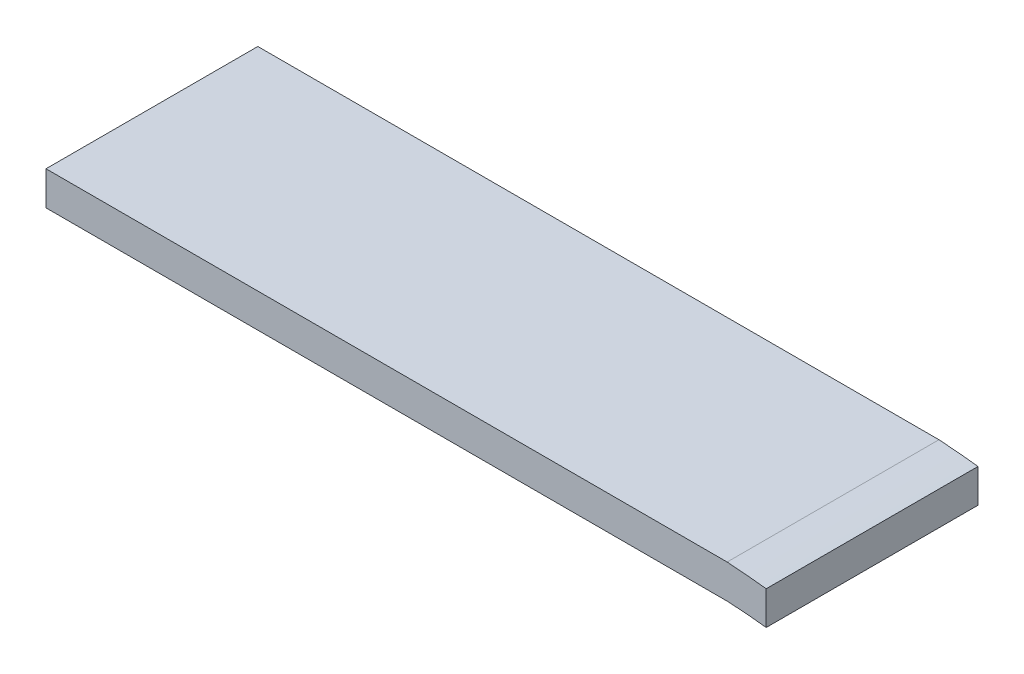
ISO-10303-21;
HEADER;
FILE_DESCRIPTION(('STEP AP214'),'2;1');
FILE_NAME('part.step','',(''),(''),'','','');
FILE_SCHEMA(('AUTOMOTIVE_DESIGN { 1 0 10303 214 1 1 1 1 }'));
ENDSEC;
DATA;
#1=APPLICATION_CONTEXT('core data for automotive mechanical design processes');
#2=APPLICATION_PROTOCOL_DEFINITION('international standard','automotive_design',2000,#1);
#3=PRODUCT_CONTEXT('',#1,'mechanical');
#4=PRODUCT('Part','Part','',(#3));
#5=PRODUCT_RELATED_PRODUCT_CATEGORY('part','',(#4));
#6=PRODUCT_DEFINITION_FORMATION('','',#4);
#7=PRODUCT_DEFINITION_CONTEXT('part definition',#1,'design');
#8=PRODUCT_DEFINITION('design','',#6,#7);
#9=PRODUCT_DEFINITION_SHAPE('','',#8);
#10=(LENGTH_UNIT() NAMED_UNIT(*) SI_UNIT(.MILLI.,.METRE.));
#11=(NAMED_UNIT(*) PLANE_ANGLE_UNIT() SI_UNIT($,.RADIAN.));
#12=(NAMED_UNIT(*) SI_UNIT($,.STERADIAN.) SOLID_ANGLE_UNIT());
#13=UNCERTAINTY_MEASURE_WITH_UNIT(LENGTH_MEASURE(1.E-05),#10,'distance_accuracy_value','');
#14=(GEOMETRIC_REPRESENTATION_CONTEXT(3) GLOBAL_UNCERTAINTY_ASSIGNED_CONTEXT((#13)) GLOBAL_UNIT_ASSIGNED_CONTEXT((#10,
#11,#12)) REPRESENTATION_CONTEXT('',''));
#15=CARTESIAN_POINT('',(0.,0.,0.));
#16=DIRECTION('',(0.,0.,1.));
#17=DIRECTION('',(1.,0.,0.));
#18=AXIS2_PLACEMENT_3D('',#15,#16,#17);
#19=CARTESIAN_POINT('',(-61.0256320098399,-12.0060003054434,-30.));
#20=DIRECTION('',(-1.,0.,0.));
#21=DIRECTION('',(0.,-1.,0.));
#22=AXIS2_PLACEMENT_3D('',#19,#20,#21);
#23=PLANE('',#22);
#24=DIRECTION('',(0.,-1.,0.));
#25=VECTOR('',#24,1.);
#26=CARTESIAN_POINT('',(-61.0256320098399,0.,-30.));
#27=LINE('',#26,#25);
#28=CARTESIAN_POINT('',(-61.0256320098399,45.6478574486308,-30.));
#29=VERTEX_POINT('',#28);
#30=CARTESIAN_POINT('',(-61.0256320098399,41.6478574486308,-30.));
#31=VERTEX_POINT('',#30);
#32=EDGE_CURVE('E113',#29,#31,#27,.T.);
#33=ORIENTED_EDGE('',*,*,#32,.T.);
#34=DIRECTION('',(0.,0.,1.));
#35=VECTOR('',#34,1.);
#36=CARTESIAN_POINT('',(-61.0256320098399,41.6478574486308,-30.));
#37=LINE('',#36,#35);
#38=CARTESIAN_POINT('',(-61.0256320098399,41.6478574486308,-5.));
#39=VERTEX_POINT('',#38);
#40=EDGE_CURVE('E116',#31,#39,#37,.T.);
#41=ORIENTED_EDGE('',*,*,#40,.T.);
#42=DIRECTION('',(0.,1.,0.));
#43=VECTOR('',#42,1.);
#44=CARTESIAN_POINT('',(-61.0256320098399,-12.0060003054434,-5.));
#45=LINE('',#44,#43);
#46=CARTESIAN_POINT('',(-61.0256320098399,45.6478574486308,-5.));
#47=VERTEX_POINT('',#46);
#48=EDGE_CURVE('E51',#39,#47,#45,.T.);
#49=ORIENTED_EDGE('',*,*,#48,.T.);
#50=DIRECTION('',(0.,0.,1.));
#51=VECTOR('',#50,1.);
#52=CARTESIAN_POINT('',(-61.0256320098399,45.6478574486308,-30.));
#53=LINE('',#52,#51);
#54=EDGE_CURVE('E103',#29,#47,#53,.T.);
#55=ORIENTED_EDGE('',*,*,#54,.F.);
#56=EDGE_LOOP('',(#33,#41,#49,#55));
#57=FACE_BOUND('',#56,.T.);
#58=ADVANCED_FACE('F41',(#57),#23,.T.);
#59=CARTESIAN_POINT('',(23.9743679901601,-12.0060003054434,-5.));
#60=DIRECTION('',(1.,0.,0.));
#61=DIRECTION('',(0.,1.,0.));
#62=AXIS2_PLACEMENT_3D('',#59,#60,#61);
#63=PLANE('',#62);
#64=DIRECTION('',(0.,1.,0.));
#65=VECTOR('',#64,1.);
#66=CARTESIAN_POINT('',(23.9743679901601,-12.0060003054434,-5.));
#67=LINE('',#66,#65);
#68=CARTESIAN_POINT('',(23.9743679901601,41.2536266071182,-5.));
#69=VERTEX_POINT('',#68);
#70=CARTESIAN_POINT('',(23.9743679901601,45.2188823674988,-5.));
#71=VERTEX_POINT('',#70);
#72=EDGE_CURVE('E11',#69,#71,#67,.T.);
#73=ORIENTED_EDGE('',*,*,#72,.F.);
#74=DIRECTION('',(0.,0.,1.));
#75=VECTOR('',#74,1.);
#76=CARTESIAN_POINT('',(23.9743679901601,41.2536266071182,-30.));
#77=LINE('',#76,#75);
#78=CARTESIAN_POINT('',(23.974367998799,41.2536266060069,-30.));
#79=VERTEX_POINT('',#78);
#80=EDGE_CURVE('E120',#69,#79,#77,.F.);
#81=ORIENTED_EDGE('',*,*,#80,.T.);
#82=DIRECTION('',(0.,1.,0.));
#83=VECTOR('',#82,1.);
#84=CARTESIAN_POINT('',(23.9743679901601,0.,-30.));
#85=LINE('',#84,#83);
#86=CARTESIAN_POINT('',(23.974367992744,45.2188823671762,-30.));
#87=VERTEX_POINT('',#86);
#88=EDGE_CURVE('E121',#79,#87,#85,.T.);
#89=ORIENTED_EDGE('',*,*,#88,.T.);
#90=DIRECTION('',(0.,0.,1.));
#91=VECTOR('',#90,1.);
#92=CARTESIAN_POINT('',(23.9743679901601,45.2188823674988,-30.));
#93=LINE('',#92,#91);
#94=EDGE_CURVE('E135',#71,#87,#93,.F.);
#95=ORIENTED_EDGE('',*,*,#94,.F.);
#96=EDGE_LOOP('',(#73,#81,#89,#95));
#97=FACE_BOUND('',#96,.T.);
#98=ADVANCED_FACE('F178',(#97),#63,.T.);
#99=CARTESIAN_POINT('',(-61.0256320098399,-12.0060003054434,-5.));
#100=DIRECTION('',(0.,0.,1.));
#101=DIRECTION('',(1.,0.,0.));
#102=AXIS2_PLACEMENT_3D('',#99,#100,#101);
#103=PLANE('',#102);
#104=ORIENTED_EDGE('',*,*,#48,.F.);
#105=DIRECTION('',(-1.,0.,0.));
#106=VECTOR('',#105,1.);
#107=CARTESIAN_POINT('',(0.,41.6478574486308,-5.));
#108=LINE('',#107,#106);
#109=CARTESIAN_POINT('',(19.3670890401002,41.6478574486308,-5.));
#110=VERTEX_POINT('',#109);
#111=EDGE_CURVE('E141',#110,#39,#108,.T.);
#112=ORIENTED_EDGE('',*,*,#111,.F.);
#113=CARTESIAN_POINT('',(49.4150820479839,16.2007454720884,-5.));
#114=CARTESIAN_POINT('',(46.8917198677697,40.3845449244708,-5.));
#115=CARTESIAN_POINT('',(19.3670890401002,41.6478574486308,-5.));
#116=B_SPLINE_CURVE_WITH_KNOTS('',2,(#113,#114,#115),.UNSPECIFIED.,.F.,.F.,(3,3),(0.,1.),.UNSPECIFIED.);
#117=EDGE_CURVE('E59',#69,#110,#116,.T.);
#118=ORIENTED_EDGE('',*,*,#117,.F.);
#119=ORIENTED_EDGE('',*,*,#72,.T.);
#120=CARTESIAN_POINT('',(56.0168990645835,16.2007454720884,-5.));
#121=CARTESIAN_POINT('',(52.8613543207825,43.5251075128018,-5.));
#122=CARTESIAN_POINT('',(19.3670890401002,45.6478574486308,-5.));
#123=B_SPLINE_CURVE_WITH_KNOTS('',2,(#120,#121,#122),.UNSPECIFIED.,.F.,.F.,(3,3),(0.,1.),.UNSPECIFIED.);
#124=CARTESIAN_POINT('',(19.3670890401002,45.6478574486308,-5.));
#125=VERTEX_POINT('',#124);
#126=EDGE_CURVE('E130',#125,#71,#123,.F.);
#127=ORIENTED_EDGE('',*,*,#126,.F.);
#128=DIRECTION('',(1.,0.,0.));
#129=VECTOR('',#128,1.);
#130=CARTESIAN_POINT('',(0.,45.6478574486308,-5.));
#131=LINE('',#130,#129);
#132=EDGE_CURVE('E115',#47,#125,#131,.T.);
#133=ORIENTED_EDGE('',*,*,#132,.F.);
#134=EDGE_LOOP('',(#104,#112,#118,#119,#127,#133));
#135=FACE_BOUND('',#134,.T.);
#136=ADVANCED_FACE('F174',(#135),#103,.T.);
#137=CARTESIAN_POINT('',(0.,0.,-30.));
#138=DIRECTION('',(0.,0.,1.));
#139=DIRECTION('',(1.,0.,0.));
#140=AXIS2_PLACEMENT_3D('',#137,#138,#139);
#141=PLANE('',#140);
#142=ORIENTED_EDGE('',*,*,#32,.F.);
#143=DIRECTION('',(-1.,0.,0.));
#144=VECTOR('',#143,1.);
#145=CARTESIAN_POINT('',(0.,45.6478574486308,-30.));
#146=LINE('',#145,#144);
#147=CARTESIAN_POINT('',(19.3670890401002,45.6478574486308,-30.));
#148=VERTEX_POINT('',#147);
#149=EDGE_CURVE('E99',#148,#29,#146,.T.);
#150=ORIENTED_EDGE('',*,*,#149,.F.);
#151=CARTESIAN_POINT('',(56.0168990645835,16.2007454720884,-30.));
#152=CARTESIAN_POINT('',(52.8613543207825,43.5251075128018,-30.));
#153=CARTESIAN_POINT('',(19.3670890401002,45.6478574486308,-30.));
#154=B_SPLINE_CURVE_WITH_KNOTS('',2,(#151,#152,#153),.UNSPECIFIED.,.F.,.F.,(3,3),(0.,1.),.UNSPECIFIED.);
#155=EDGE_CURVE('E108',#87,#148,#154,.T.);
#156=ORIENTED_EDGE('',*,*,#155,.F.);
#157=ORIENTED_EDGE('',*,*,#88,.F.);
#158=CARTESIAN_POINT('',(49.4150820479839,16.2007454720884,-30.));
#159=CARTESIAN_POINT('',(46.8917198677697,40.3845449244708,-30.));
#160=CARTESIAN_POINT('',(19.3670890401002,41.6478574486308,-30.));
#161=B_SPLINE_CURVE_WITH_KNOTS('',2,(#158,#159,#160),.UNSPECIFIED.,.F.,.F.,(3,3),(0.,1.),.UNSPECIFIED.);
#162=CARTESIAN_POINT('',(19.3670890401002,41.6478574486308,-30.));
#163=VERTEX_POINT('',#162);
#164=EDGE_CURVE('E67',#79,#163,#161,.T.);
#165=ORIENTED_EDGE('',*,*,#164,.T.);
#166=DIRECTION('',(-1.,0.,0.));
#167=VECTOR('',#166,1.);
#168=CARTESIAN_POINT('',(0.,41.6478574486308,-30.));
#169=LINE('',#168,#167);
#170=EDGE_CURVE('E107',#163,#31,#169,.T.);
#171=ORIENTED_EDGE('',*,*,#170,.T.);
#172=EDGE_LOOP('',(#142,#150,#156,#157,#165,#171));
#173=FACE_BOUND('',#172,.T.);
#174=ADVANCED_FACE('F118',(#173),#141,.F.);
#175=DIRECTION('',(0.,0.,1.));
#176=VECTOR('',#175,1.);
#177=SURFACE_OF_LINEAR_EXTRUSION('',#161,#176);
#178=ORIENTED_EDGE('',*,*,#80,.F.);
#179=ORIENTED_EDGE('',*,*,#117,.T.);
#180=DIRECTION('',(0.,0.,1.));
#181=VECTOR('',#180,1.);
#182=CARTESIAN_POINT('',(19.3670890401002,41.6478574486308,-30.));
#183=LINE('',#182,#181);
#184=EDGE_CURVE('E142',#163,#110,#183,.T.);
#185=ORIENTED_EDGE('',*,*,#184,.F.);
#186=ORIENTED_EDGE('',*,*,#164,.F.);
#187=EDGE_LOOP('',(#178,#179,#185,#186));
#188=FACE_BOUND('',#187,.T.);
#189=ADVANCED_FACE('F168',(#188),#177,.F.);
#190=CARTESIAN_POINT('',(0.,41.6478574486308,-30.));
#191=DIRECTION('',(0.,1.,0.));
#192=DIRECTION('',(-1.,0.,0.));
#193=AXIS2_PLACEMENT_3D('',#190,#191,#192);
#194=PLANE('',#193);
#195=ORIENTED_EDGE('',*,*,#40,.F.);
#196=ORIENTED_EDGE('',*,*,#170,.F.);
#197=ORIENTED_EDGE('',*,*,#184,.T.);
#198=ORIENTED_EDGE('',*,*,#111,.T.);
#199=EDGE_LOOP('',(#195,#196,#197,#198));
#200=FACE_BOUND('',#199,.T.);
#201=ADVANCED_FACE('F171',(#200),#194,.F.);
#202=CARTESIAN_POINT('',(0.,45.6478574486308,-30.));
#203=DIRECTION('',(0.,1.,0.));
#204=DIRECTION('',(-1.,0.,0.));
#205=AXIS2_PLACEMENT_3D('',#202,#203,#204);
#206=PLANE('',#205);
#207=ORIENTED_EDGE('',*,*,#149,.T.);
#208=ORIENTED_EDGE('',*,*,#54,.T.);
#209=ORIENTED_EDGE('',*,*,#132,.T.);
#210=DIRECTION('',(0.,0.,1.));
#211=VECTOR('',#210,1.);
#212=CARTESIAN_POINT('',(19.3670890401002,45.6478574486308,-30.));
#213=LINE('',#212,#211);
#214=EDGE_CURVE('E105',#148,#125,#213,.T.);
#215=ORIENTED_EDGE('',*,*,#214,.F.);
#216=EDGE_LOOP('',(#207,#208,#209,#215));
#217=FACE_BOUND('',#216,.T.);
#218=ADVANCED_FACE('F101',(#217),#206,.T.);
#219=DIRECTION('',(0.,0.,1.));
#220=VECTOR('',#219,1.);
#221=SURFACE_OF_LINEAR_EXTRUSION('',#154,#220);
#222=ORIENTED_EDGE('',*,*,#214,.T.);
#223=ORIENTED_EDGE('',*,*,#126,.T.);
#224=ORIENTED_EDGE('',*,*,#94,.T.);
#225=ORIENTED_EDGE('',*,*,#155,.T.);
#226=EDGE_LOOP('',(#222,#223,#224,#225));
#227=FACE_BOUND('',#226,.T.);
#228=ADVANCED_FACE('F43',(#227),#221,.T.);
#229=CLOSED_SHELL('',(#58,#98,#136,#174,#189,#201,#218,#228));
#230=MANIFOLD_SOLID_BREP('B2',#229);
#231=ADVANCED_BREP_SHAPE_REPRESENTATION('',(#18,#230),#14);
#232=SHAPE_DEFINITION_REPRESENTATION(#9,#231);
ENDSEC;
END-ISO-10303-21;
